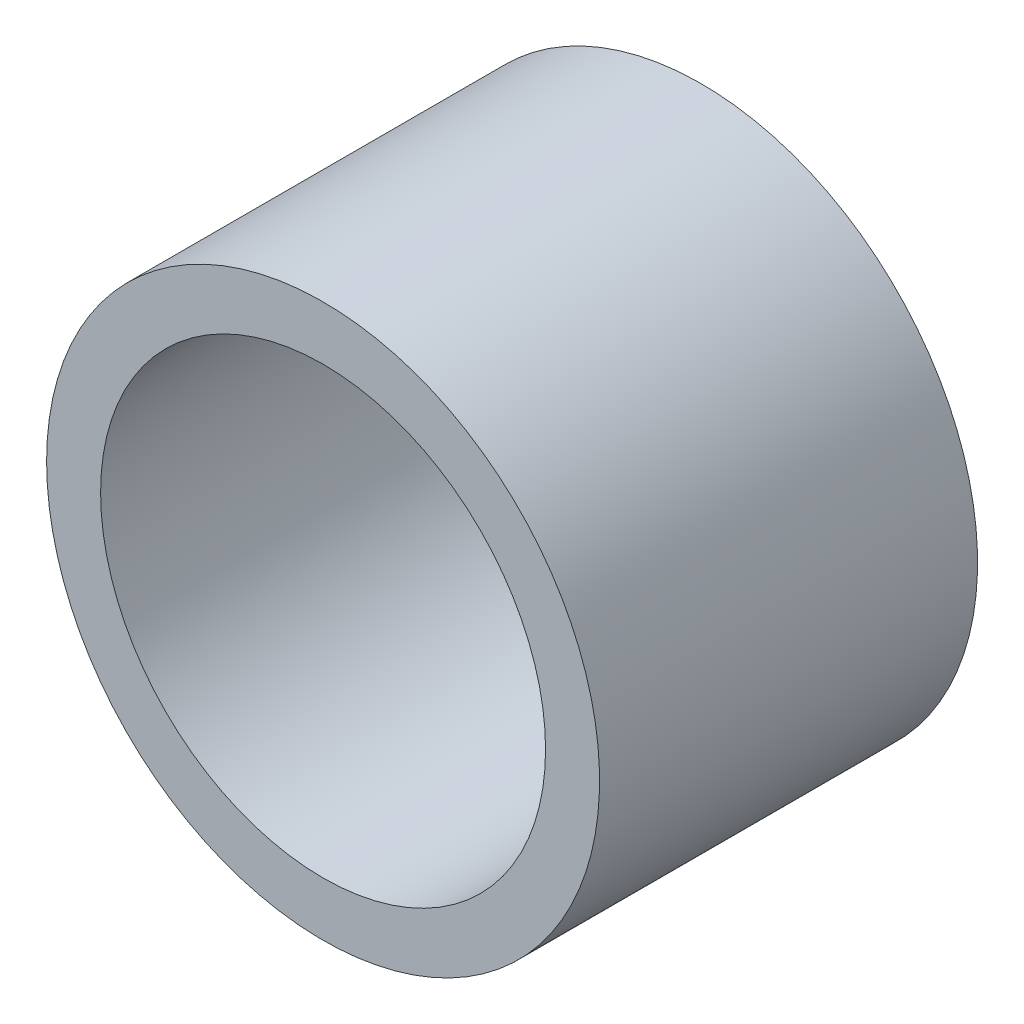
ISO-10303-21;
HEADER;
FILE_DESCRIPTION(('STEP AP214'),'2;1');
FILE_NAME('part.step','',(''),(''),'','','');
FILE_SCHEMA(('AUTOMOTIVE_DESIGN { 1 0 10303 214 1 1 1 1 }'));
ENDSEC;
DATA;
#1=APPLICATION_CONTEXT('core data for automotive mechanical design processes');
#2=APPLICATION_PROTOCOL_DEFINITION('international standard','automotive_design',2000,#1);
#3=PRODUCT_CONTEXT('',#1,'mechanical');
#4=PRODUCT('Part','Part','',(#3));
#5=PRODUCT_RELATED_PRODUCT_CATEGORY('part','',(#4));
#6=PRODUCT_DEFINITION_FORMATION('','',#4);
#7=PRODUCT_DEFINITION_CONTEXT('part definition',#1,'design');
#8=PRODUCT_DEFINITION('design','',#6,#7);
#9=PRODUCT_DEFINITION_SHAPE('','',#8);
#10=(LENGTH_UNIT() NAMED_UNIT(*) SI_UNIT(.MILLI.,.METRE.));
#11=(NAMED_UNIT(*) PLANE_ANGLE_UNIT() SI_UNIT($,.RADIAN.));
#12=(NAMED_UNIT(*) SI_UNIT($,.STERADIAN.) SOLID_ANGLE_UNIT());
#13=UNCERTAINTY_MEASURE_WITH_UNIT(LENGTH_MEASURE(1.E-05),#10,'distance_accuracy_value','');
#14=(GEOMETRIC_REPRESENTATION_CONTEXT(3) GLOBAL_UNCERTAINTY_ASSIGNED_CONTEXT((#13)) GLOBAL_UNIT_ASSIGNED_CONTEXT((#10,
#11,#12)) REPRESENTATION_CONTEXT('',''));
#15=CARTESIAN_POINT('',(0.,0.,0.));
#16=DIRECTION('',(0.,0.,1.));
#17=DIRECTION('',(1.,0.,0.));
#18=AXIS2_PLACEMENT_3D('',#15,#16,#17);
#19=CARTESIAN_POINT('',(0.,0.,0.));
#20=DIRECTION('',(0.,0.,-1.));
#21=DIRECTION('',(-1.,0.,0.));
#22=AXIS2_PLACEMENT_3D('',#19,#20,#21);
#23=CYLINDRICAL_SURFACE('',#22,26.162);
#24=CARTESIAN_POINT('',(0.,0.,0.));
#25=DIRECTION('',(0.,0.,-1.));
#26=DIRECTION('',(-1.,0.,0.));
#27=AXIS2_PLACEMENT_3D('',#24,#25,#26);
#28=CIRCLE('',#27,26.162);
#29=CARTESIAN_POINT('',(-26.162,0.,0.));
#30=VERTEX_POINT('',#29);
#31=EDGE_CURVE('E10',#30,#30,#28,.T.);
#32=ORIENTED_EDGE('',*,*,#31,.T.);
#33=EDGE_LOOP('',(#32));
#34=FACE_BOUND('',#33,.T.);
#35=CARTESIAN_POINT('',(0.,0.,44.45));
#36=DIRECTION('',(0.,0.,-1.));
#37=DIRECTION('',(-1.,0.,0.));
#38=AXIS2_PLACEMENT_3D('',#35,#36,#37);
#39=CIRCLE('',#38,26.162);
#40=CARTESIAN_POINT('',(-26.162,0.,44.45));
#41=VERTEX_POINT('',#40);
#42=EDGE_CURVE('E54',#41,#41,#39,.T.);
#43=ORIENTED_EDGE('',*,*,#42,.F.);
#44=EDGE_LOOP('',(#43));
#45=FACE_BOUND('',#44,.T.);
#46=ADVANCED_FACE('F37',(#34,#45),#23,.F.);
#47=CARTESIAN_POINT('',(0.,26.162,0.));
#48=DIRECTION('',(0.,0.,-1.));
#49=DIRECTION('',(-1.,0.,0.));
#50=AXIS2_PLACEMENT_3D('',#47,#48,#49);
#51=PLANE('',#50);
#52=CARTESIAN_POINT('',(0.,0.,0.));
#53=DIRECTION('',(0.,0.,-1.));
#54=DIRECTION('',(-1.,0.,0.));
#55=AXIS2_PLACEMENT_3D('',#52,#53,#54);
#56=CIRCLE('',#55,32.512);
#57=CARTESIAN_POINT('',(-32.512,0.,0.));
#58=VERTEX_POINT('',#57);
#59=EDGE_CURVE('E44',#58,#58,#56,.T.);
#60=ORIENTED_EDGE('',*,*,#59,.T.);
#61=EDGE_LOOP('',(#60));
#62=FACE_BOUND('',#61,.T.);
#63=ORIENTED_EDGE('',*,*,#31,.F.);
#64=EDGE_LOOP('',(#63));
#65=FACE_BOUND('',#64,.T.);
#66=ADVANCED_FACE('F65',(#62,#65),#51,.T.);
#67=CARTESIAN_POINT('',(0.,0.,0.));
#68=DIRECTION('',(0.,0.,-1.));
#69=DIRECTION('',(-1.,0.,0.));
#70=AXIS2_PLACEMENT_3D('',#67,#68,#69);
#71=CYLINDRICAL_SURFACE('',#70,32.512);
#72=CARTESIAN_POINT('',(0.,0.,44.45));
#73=DIRECTION('',(0.,0.,-1.));
#74=DIRECTION('',(-1.,0.,0.));
#75=AXIS2_PLACEMENT_3D('',#72,#73,#74);
#76=CIRCLE('',#75,32.512);
#77=CARTESIAN_POINT('',(-32.512,0.,44.45));
#78=VERTEX_POINT('',#77);
#79=EDGE_CURVE('E49',#78,#78,#76,.T.);
#80=ORIENTED_EDGE('',*,*,#79,.T.);
#81=EDGE_LOOP('',(#80));
#82=FACE_BOUND('',#81,.T.);
#83=ORIENTED_EDGE('',*,*,#59,.F.);
#84=EDGE_LOOP('',(#83));
#85=FACE_BOUND('',#84,.T.);
#86=ADVANCED_FACE('F69',(#82,#85),#71,.T.);
#87=CARTESIAN_POINT('',(0.,32.512,44.45));
#88=DIRECTION('',(0.,0.,1.));
#89=DIRECTION('',(1.,0.,0.));
#90=AXIS2_PLACEMENT_3D('',#87,#88,#89);
#91=PLANE('',#90);
#92=ORIENTED_EDGE('',*,*,#42,.T.);
#93=EDGE_LOOP('',(#92));
#94=FACE_BOUND('',#93,.T.);
#95=ORIENTED_EDGE('',*,*,#79,.F.);
#96=EDGE_LOOP('',(#95));
#97=FACE_BOUND('',#96,.T.);
#98=ADVANCED_FACE('F61',(#94,#97),#91,.T.);
#99=CLOSED_SHELL('',(#46,#66,#86,#98));
#100=MANIFOLD_SOLID_BREP('B2',#99);
#101=ADVANCED_BREP_SHAPE_REPRESENTATION('',(#18,#100),#14);
#102=SHAPE_DEFINITION_REPRESENTATION(#9,#101);
ENDSEC;
END-ISO-10303-21;
